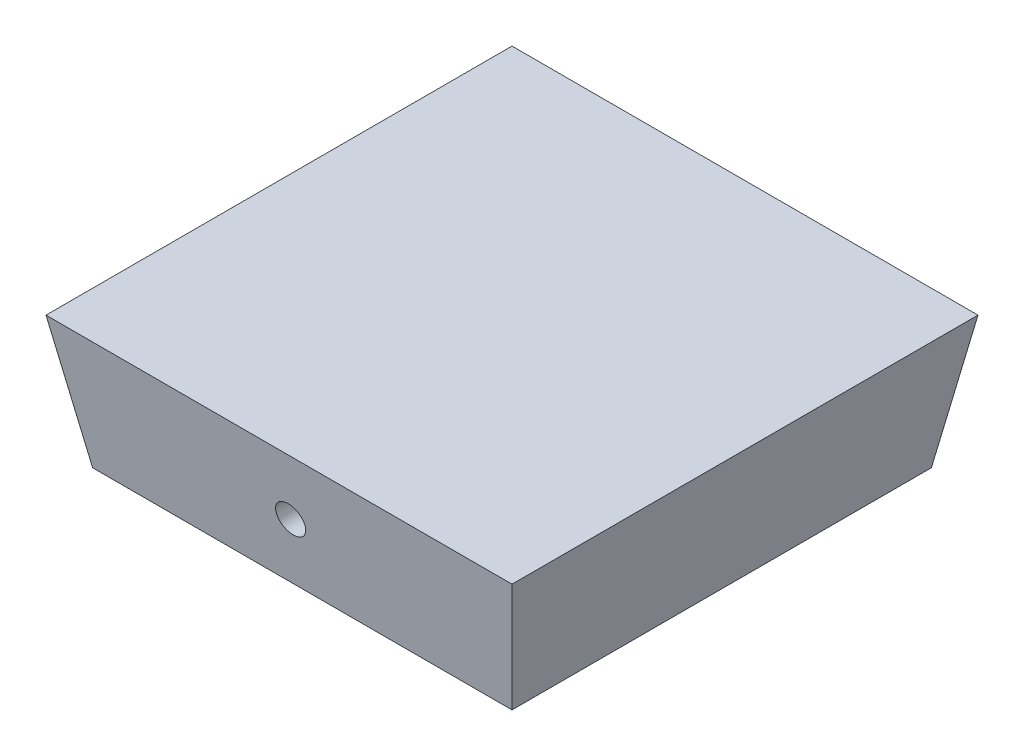
ISO-10303-21;
HEADER;
FILE_DESCRIPTION(('STEP AP214'),'2;1');
FILE_NAME('part.step','',(''),(''),'','','');
FILE_SCHEMA(('AUTOMOTIVE_DESIGN { 1 0 10303 214 1 1 1 1 }'));
ENDSEC;
DATA;
#1=APPLICATION_CONTEXT('core data for automotive mechanical design processes');
#2=APPLICATION_PROTOCOL_DEFINITION('international standard','automotive_design',2000,#1);
#3=PRODUCT_CONTEXT('',#1,'mechanical');
#4=PRODUCT('Part','Part','',(#3));
#5=PRODUCT_RELATED_PRODUCT_CATEGORY('part','',(#4));
#6=PRODUCT_DEFINITION_FORMATION('','',#4);
#7=PRODUCT_DEFINITION_CONTEXT('part definition',#1,'design');
#8=PRODUCT_DEFINITION('design','',#6,#7);
#9=PRODUCT_DEFINITION_SHAPE('','',#8);
#10=(LENGTH_UNIT() NAMED_UNIT(*) SI_UNIT(.MILLI.,.METRE.));
#11=(NAMED_UNIT(*) PLANE_ANGLE_UNIT() SI_UNIT($,.RADIAN.));
#12=(NAMED_UNIT(*) SI_UNIT($,.STERADIAN.) SOLID_ANGLE_UNIT());
#13=UNCERTAINTY_MEASURE_WITH_UNIT(LENGTH_MEASURE(1.E-05),#10,'distance_accuracy_value','');
#14=(GEOMETRIC_REPRESENTATION_CONTEXT(3) GLOBAL_UNCERTAINTY_ASSIGNED_CONTEXT((#13)) GLOBAL_UNIT_ASSIGNED_CONTEXT((#10,
#11,#12)) REPRESENTATION_CONTEXT('',''));
#15=CARTESIAN_POINT('',(0.,0.,0.));
#16=DIRECTION('',(0.,0.,1.));
#17=DIRECTION('',(1.,0.,0.));
#18=AXIS2_PLACEMENT_3D('',#15,#16,#17);
#19=CARTESIAN_POINT('',(23.495,0.,23.495));
#20=DIRECTION('',(0.984807753012208,-0.173648177666931,0.));
#21=DIRECTION('',(0.173648177666931,0.984807753012208,0.));
#22=AXIS2_PLACEMENT_3D('',#19,#20,#21);
#23=PLANE('',#22);
#24=DIRECTION('',(0.,0.,-1.));
#25=VECTOR('',#24,1.);
#26=CARTESIAN_POINT('',(23.495,0.,23.495));
#27=LINE('',#26,#25);
#28=CARTESIAN_POINT('',(23.495,0.,23.495));
#29=VERTEX_POINT('',#28);
#30=CARTESIAN_POINT('',(23.495,0.,-23.495));
#31=VERTEX_POINT('',#30);
#32=EDGE_CURVE('E79',#29,#31,#27,.T.);
#33=ORIENTED_EDGE('',*,*,#32,.T.);
#34=DIRECTION('',(-0.171087869746036,-0.970287525247814,0.171087869746036));
#35=VECTOR('',#34,1.);
#36=CARTESIAN_POINT('',(22.1195529294026,-7.80054796532531,-22.1195529294026));
#37=LINE('',#36,#35);
#38=CARTESIAN_POINT('',(26.1074288073201,14.81582,-26.1074288073201));
#39=VERTEX_POINT('',#38);
#40=EDGE_CURVE('E11',#39,#31,#37,.T.);
#41=ORIENTED_EDGE('',*,*,#40,.F.);
#42=DIRECTION('',(0.,0.,1.));
#43=VECTOR('',#42,1.);
#44=CARTESIAN_POINT('',(26.1074288073201,14.81582,0.));
#45=LINE('',#44,#43);
#46=CARTESIAN_POINT('',(26.1074288073201,14.81582,26.1074288073201));
#47=VERTEX_POINT('',#46);
#48=EDGE_CURVE('E98',#47,#39,#45,.F.);
#49=ORIENTED_EDGE('',*,*,#48,.F.);
#50=DIRECTION('',(-0.171087869746036,-0.970287525247814,-0.171087869746036));
#51=VECTOR('',#50,1.);
#52=CARTESIAN_POINT('',(23.495,0.,23.495));
#53=LINE('',#52,#51);
#54=EDGE_CURVE('E90',#47,#29,#53,.T.);
#55=ORIENTED_EDGE('',*,*,#54,.T.);
#56=EDGE_LOOP('',(#33,#41,#49,#55));
#57=FACE_BOUND('',#56,.T.);
#58=ADVANCED_FACE('F32',(#57),#23,.T.);
#59=CARTESIAN_POINT('',(-23.495,0.,-23.495));
#60=DIRECTION('',(0.,-0.173648177666931,-0.984807753012208));
#61=DIRECTION('',(0.,0.984807753012208,-0.173648177666931));
#62=AXIS2_PLACEMENT_3D('',#59,#60,#61);
#63=PLANE('',#62);
#64=DIRECTION('',(-1.,0.,0.));
#65=VECTOR('',#64,1.);
#66=CARTESIAN_POINT('',(-23.495,0.,-23.495));
#67=LINE('',#66,#65);
#68=CARTESIAN_POINT('',(-23.495,0.,-23.495));
#69=VERTEX_POINT('',#68);
#70=EDGE_CURVE('E75',#31,#69,#67,.T.);
#71=ORIENTED_EDGE('',*,*,#70,.T.);
#72=DIRECTION('',(0.171087869746036,-0.970287525247814,0.171087869746036));
#73=VECTOR('',#72,1.);
#74=CARTESIAN_POINT('',(-22.1195529294026,-7.80054796532531,-22.1195529294026));
#75=LINE('',#74,#73);
#76=CARTESIAN_POINT('',(-26.1074288073201,14.81582,-26.1074288073201));
#77=VERTEX_POINT('',#76);
#78=EDGE_CURVE('E41',#77,#69,#75,.T.);
#79=ORIENTED_EDGE('',*,*,#78,.F.);
#80=DIRECTION('',(1.,0.,0.));
#81=VECTOR('',#80,1.);
#82=CARTESIAN_POINT('',(0.,14.81582,-26.1074288073201));
#83=LINE('',#82,#81);
#84=EDGE_CURVE('E86',#39,#77,#83,.F.);
#85=ORIENTED_EDGE('',*,*,#84,.F.);
#86=ORIENTED_EDGE('',*,*,#40,.T.);
#87=EDGE_LOOP('',(#71,#79,#85,#86));
#88=FACE_BOUND('',#87,.T.);
#89=ADVANCED_FACE('F34',(#88),#63,.T.);
#90=CARTESIAN_POINT('',(-23.495,0.,23.495));
#91=DIRECTION('',(-0.984807753012208,-0.173648177666931,0.));
#92=DIRECTION('',(0.173648177666931,-0.984807753012208,0.));
#93=AXIS2_PLACEMENT_3D('',#90,#91,#92);
#94=PLANE('',#93);
#95=DIRECTION('',(0.,0.,1.));
#96=VECTOR('',#95,1.);
#97=CARTESIAN_POINT('',(-23.495,0.,23.495));
#98=LINE('',#97,#96);
#99=CARTESIAN_POINT('',(-23.495,0.,23.495));
#100=VERTEX_POINT('',#99);
#101=EDGE_CURVE('E80',#69,#100,#98,.T.);
#102=ORIENTED_EDGE('',*,*,#101,.T.);
#103=DIRECTION('',(0.171087869746036,-0.970287525247814,-0.171087869746036));
#104=VECTOR('',#103,1.);
#105=CARTESIAN_POINT('',(-23.495,0.,23.495));
#106=LINE('',#105,#104);
#107=CARTESIAN_POINT('',(-26.1074288073201,14.81582,26.1074288073201));
#108=VERTEX_POINT('',#107);
#109=EDGE_CURVE('E101',#108,#100,#106,.T.);
#110=ORIENTED_EDGE('',*,*,#109,.F.);
#111=DIRECTION('',(0.,0.,-1.));
#112=VECTOR('',#111,1.);
#113=CARTESIAN_POINT('',(-26.1074288073201,14.81582,0.));
#114=LINE('',#113,#112);
#115=EDGE_CURVE('E54',#77,#108,#114,.F.);
#116=ORIENTED_EDGE('',*,*,#115,.F.);
#117=ORIENTED_EDGE('',*,*,#78,.T.);
#118=EDGE_LOOP('',(#102,#110,#116,#117));
#119=FACE_BOUND('',#118,.T.);
#120=ADVANCED_FACE('F109',(#119),#94,.T.);
#121=CARTESIAN_POINT('',(-23.495,0.,23.495));
#122=DIRECTION('',(0.,-0.173648177666931,0.984807753012208));
#123=DIRECTION('',(0.,-0.984807753012208,-0.173648177666931));
#124=AXIS2_PLACEMENT_3D('',#121,#122,#123);
#125=PLANE('',#124);
#126=CARTESIAN_POINT('',(0.,7.40791,24.8012144036601));
#127=DIRECTION('',(0.,-0.173648177666931,0.984807753012208));
#128=DIRECTION('',(0.,0.984807753012208,0.173648177666931));
#129=AXIS2_PLACEMENT_3D('',#126,#127,#128);
#130=ELLIPSE('',#129,1.69258923368705,1.666875);
#131=CARTESIAN_POINT('',(0.,9.074785,25.0951294396285));
#132=VERTEX_POINT('',#131);
#133=EDGE_CURVE('E36',#132,#132,#130,.F.);
#134=ORIENTED_EDGE('',*,*,#133,.T.);
#135=EDGE_LOOP('',(#134));
#136=FACE_BOUND('',#135,.T.);
#137=DIRECTION('',(1.,0.,0.));
#138=VECTOR('',#137,1.);
#139=CARTESIAN_POINT('',(-23.495,0.,23.495));
#140=LINE('',#139,#138);
#141=EDGE_CURVE('E97',#100,#29,#140,.T.);
#142=ORIENTED_EDGE('',*,*,#141,.T.);
#143=ORIENTED_EDGE('',*,*,#54,.F.);
#144=DIRECTION('',(-1.,0.,0.));
#145=VECTOR('',#144,1.);
#146=CARTESIAN_POINT('',(0.,14.81582,26.1074288073201));
#147=LINE('',#146,#145);
#148=EDGE_CURVE('E49',#108,#47,#147,.F.);
#149=ORIENTED_EDGE('',*,*,#148,.F.);
#150=ORIENTED_EDGE('',*,*,#109,.T.);
#151=EDGE_LOOP('',(#142,#143,#149,#150));
#152=FACE_BOUND('',#151,.T.);
#153=ADVANCED_FACE('F111',(#136,#152),#125,.T.);
#154=CARTESIAN_POINT('',(0.,14.81582,0.));
#155=DIRECTION('',(0.,-1.,0.));
#156=DIRECTION('',(0.,0.,-1.));
#157=AXIS2_PLACEMENT_3D('',#154,#155,#156);
#158=PLANE('',#157);
#159=ORIENTED_EDGE('',*,*,#48,.T.);
#160=ORIENTED_EDGE('',*,*,#84,.T.);
#161=ORIENTED_EDGE('',*,*,#115,.T.);
#162=ORIENTED_EDGE('',*,*,#148,.T.);
#163=EDGE_LOOP('',(#159,#160,#161,#162));
#164=FACE_BOUND('',#163,.T.);
#165=ADVANCED_FACE('F107',(#164),#158,.F.);
#166=CARTESIAN_POINT('',(0.,0.,0.));
#167=DIRECTION('',(0.,-1.,0.));
#168=DIRECTION('',(0.,0.,-1.));
#169=AXIS2_PLACEMENT_3D('',#166,#167,#168);
#170=PLANE('',#169);
#171=ORIENTED_EDGE('',*,*,#32,.F.);
#172=ORIENTED_EDGE('',*,*,#141,.F.);
#173=ORIENTED_EDGE('',*,*,#101,.F.);
#174=ORIENTED_EDGE('',*,*,#70,.F.);
#175=EDGE_LOOP('',(#171,#172,#173,#174));
#176=FACE_BOUND('',#175,.T.);
#177=ADVANCED_FACE('F76',(#176),#170,.T.);
#178=CARTESIAN_POINT('',(0.,7.40791,13.97));
#179=DIRECTION('',(0.,0.,1.));
#180=DIRECTION('',(1.,0.,0.));
#181=AXIS2_PLACEMENT_3D('',#178,#179,#180);
#182=CYLINDRICAL_SURFACE('',#181,1.666875);
#183=CARTESIAN_POINT('',(0.,7.40791,13.97));
#184=DIRECTION('',(0.,0.,1.));
#185=DIRECTION('',(1.,0.,0.));
#186=AXIS2_PLACEMENT_3D('',#183,#184,#185);
#187=CIRCLE('',#186,1.666875);
#188=CARTESIAN_POINT('',(1.666875,7.40791,13.97));
#189=VERTEX_POINT('',#188);
#190=EDGE_CURVE('E93',#189,#189,#187,.T.);
#191=ORIENTED_EDGE('',*,*,#190,.F.);
#192=EDGE_LOOP('',(#191));
#193=FACE_BOUND('',#192,.T.);
#194=ORIENTED_EDGE('',*,*,#133,.F.);
#195=EDGE_LOOP('',(#194));
#196=FACE_BOUND('',#195,.T.);
#197=ADVANCED_FACE('F127',(#193,#196),#182,.F.);
#198=CARTESIAN_POINT('',(0.,7.40791,13.97));
#199=DIRECTION('',(0.,0.,1.));
#200=DIRECTION('',(1.,0.,0.));
#201=AXIS2_PLACEMENT_3D('',#198,#199,#200);
#202=PLANE('',#201);
#203=ORIENTED_EDGE('',*,*,#190,.T.);
#204=EDGE_LOOP('',(#203));
#205=FACE_BOUND('',#204,.T.);
#206=ADVANCED_FACE('F131',(#205),#202,.T.);
#207=CLOSED_SHELL('',(#58,#89,#120,#153,#165,#177,#197,#206));
#208=MANIFOLD_SOLID_BREP('B2',#207);
#209=ADVANCED_BREP_SHAPE_REPRESENTATION('',(#18,#208),#14);
#210=SHAPE_DEFINITION_REPRESENTATION(#9,#209);
ENDSEC;
END-ISO-10303-21;
